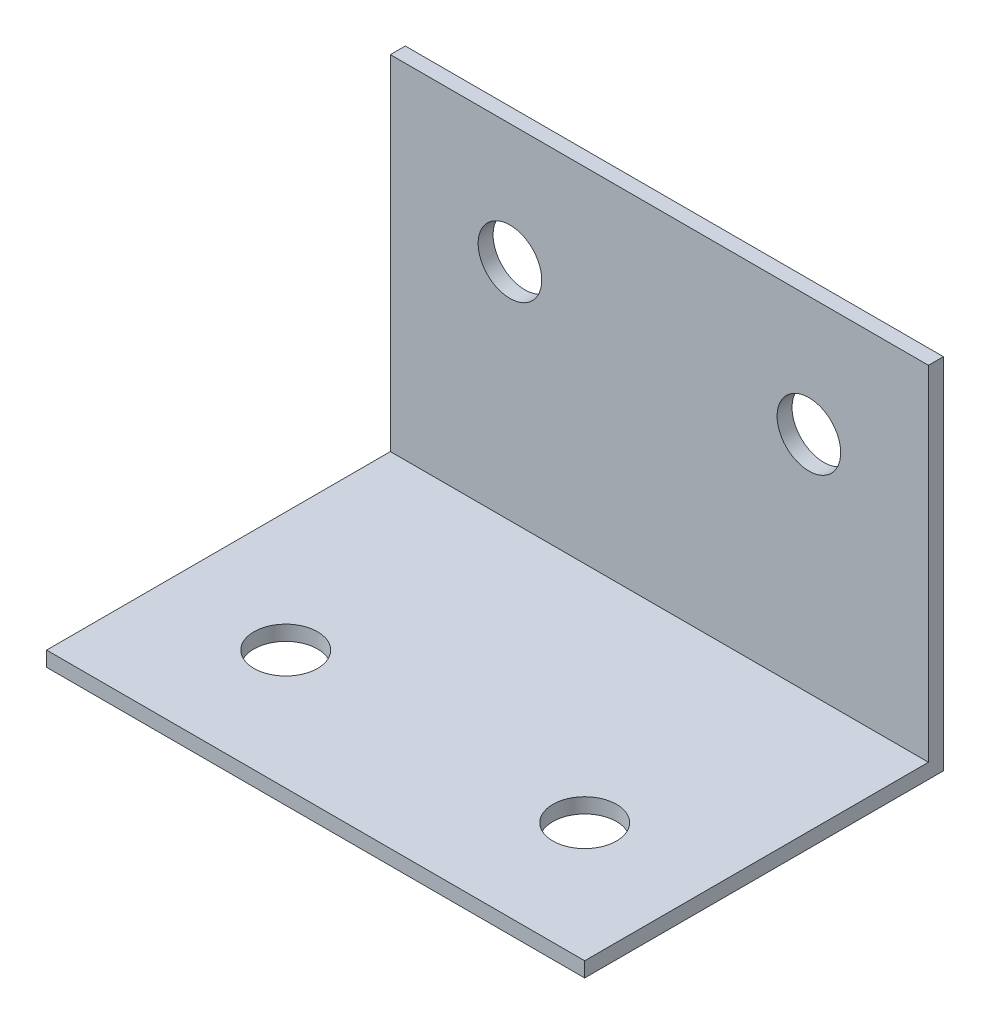
ISO-10303-21;
HEADER;
FILE_DESCRIPTION(('STEP AP214'),'2;1');
FILE_NAME('part.step','',(''),(''),'','','');
FILE_SCHEMA(('AUTOMOTIVE_DESIGN { 1 0 10303 214 1 1 1 1 }'));
ENDSEC;
DATA;
#1=APPLICATION_CONTEXT('core data for automotive mechanical design processes');
#2=APPLICATION_PROTOCOL_DEFINITION('international standard','automotive_design',2000,#1);
#3=PRODUCT_CONTEXT('',#1,'mechanical');
#4=PRODUCT('Part','Part','',(#3));
#5=PRODUCT_RELATED_PRODUCT_CATEGORY('part','',(#4));
#6=PRODUCT_DEFINITION_FORMATION('','',#4);
#7=PRODUCT_DEFINITION_CONTEXT('part definition',#1,'design');
#8=PRODUCT_DEFINITION('design','',#6,#7);
#9=PRODUCT_DEFINITION_SHAPE('','',#8);
#10=(LENGTH_UNIT() NAMED_UNIT(*) SI_UNIT(.MILLI.,.METRE.));
#11=(NAMED_UNIT(*) PLANE_ANGLE_UNIT() SI_UNIT($,.RADIAN.));
#12=(NAMED_UNIT(*) SI_UNIT($,.STERADIAN.) SOLID_ANGLE_UNIT());
#13=UNCERTAINTY_MEASURE_WITH_UNIT(LENGTH_MEASURE(1.E-05),#10,'distance_accuracy_value','');
#14=(GEOMETRIC_REPRESENTATION_CONTEXT(3) GLOBAL_UNCERTAINTY_ASSIGNED_CONTEXT((#13)) GLOBAL_UNIT_ASSIGNED_CONTEXT((#10,
#11,#12)) REPRESENTATION_CONTEXT('',''));
#15=CARTESIAN_POINT('',(0.,0.,0.));
#16=DIRECTION('',(0.,0.,1.));
#17=DIRECTION('',(1.,0.,0.));
#18=AXIS2_PLACEMENT_3D('',#15,#16,#17);
#19=CARTESIAN_POINT('',(0.,1.5875,0.));
#20=DIRECTION('',(0.,-1.,0.));
#21=DIRECTION('',(0.,0.,-1.));
#22=AXIS2_PLACEMENT_3D('',#19,#20,#21);
#23=PLANE('',#22);
#24=DIRECTION('',(1.,0.,0.));
#25=VECTOR('',#24,1.);
#26=CARTESIAN_POINT('',(-28.575,1.5875,38.1));
#27=LINE('',#26,#25);
#28=CARTESIAN_POINT('',(-28.575,1.5875,38.1));
#29=VERTEX_POINT('',#28);
#30=CARTESIAN_POINT('',(28.575,1.5875,38.1));
#31=VERTEX_POINT('',#30);
#32=EDGE_CURVE('E75',#29,#31,#27,.T.);
#33=ORIENTED_EDGE('',*,*,#32,.T.);
#34=DIRECTION('',(0.,0.,-1.));
#35=VECTOR('',#34,1.);
#36=CARTESIAN_POINT('',(28.575,1.5875,38.1));
#37=LINE('',#36,#35);
#38=CARTESIAN_POINT('',(28.575,1.58749999999999,1.58749999999987));
#39=VERTEX_POINT('',#38);
#40=EDGE_CURVE('E123',#31,#39,#37,.T.);
#41=ORIENTED_EDGE('',*,*,#40,.T.);
#42=DIRECTION('',(1.,0.,0.));
#43=VECTOR('',#42,1.);
#44=CARTESIAN_POINT('',(-28.575,1.58749999999999,1.58749999999987));
#45=LINE('',#44,#43);
#46=CARTESIAN_POINT('',(-28.575,1.58749999999999,1.58749999999987));
#47=VERTEX_POINT('',#46);
#48=EDGE_CURVE('E130',#47,#39,#45,.T.);
#49=ORIENTED_EDGE('',*,*,#48,.F.);
#50=DIRECTION('',(0.,0.,1.));
#51=VECTOR('',#50,1.);
#52=CARTESIAN_POINT('',(-28.575,1.5875,38.1));
#53=LINE('',#52,#51);
#54=EDGE_CURVE('E120',#47,#29,#53,.T.);
#55=ORIENTED_EDGE('',*,*,#54,.T.);
#56=EDGE_LOOP('',(#33,#41,#49,#55));
#57=FACE_BOUND('',#56,.T.);
#58=CARTESIAN_POINT('',(15.875,1.5875,25.4));
#59=DIRECTION('',(0.,1.,0.));
#60=DIRECTION('',(0.,0.,1.));
#61=AXIS2_PLACEMENT_3D('',#58,#59,#60);
#62=CIRCLE('',#61,3.3782);
#63=CARTESIAN_POINT('',(15.875,1.5875,28.7782));
#64=VERTEX_POINT('',#63);
#65=EDGE_CURVE('E159',#64,#64,#62,.T.);
#66=ORIENTED_EDGE('',*,*,#65,.F.);
#67=EDGE_LOOP('',(#66));
#68=FACE_BOUND('',#67,.T.);
#69=CARTESIAN_POINT('',(-15.875,1.5875,25.4));
#70=DIRECTION('',(0.,1.,0.));
#71=DIRECTION('',(0.,0.,1.));
#72=AXIS2_PLACEMENT_3D('',#69,#70,#71);
#73=CIRCLE('',#72,3.3782);
#74=CARTESIAN_POINT('',(-15.875,1.5875,28.7782));
#75=VERTEX_POINT('',#74);
#76=EDGE_CURVE('E153',#75,#75,#73,.T.);
#77=ORIENTED_EDGE('',*,*,#76,.F.);
#78=EDGE_LOOP('',(#77));
#79=FACE_BOUND('',#78,.T.);
#80=ADVANCED_FACE('F58',(#57,#68,#79),#23,.F.);
#81=CARTESIAN_POINT('',(28.575,1.5875,38.1));
#82=DIRECTION('',(-1.,0.,0.));
#83=DIRECTION('',(0.,0.,1.));
#84=AXIS2_PLACEMENT_3D('',#81,#82,#83);
#85=PLANE('',#84);
#86=DIRECTION('',(0.,0.,-1.));
#87=VECTOR('',#86,1.);
#88=CARTESIAN_POINT('',(28.575,0.,38.1));
#89=LINE('',#88,#87);
#90=CARTESIAN_POINT('',(28.575,0.,38.1));
#91=VERTEX_POINT('',#90);
#92=CARTESIAN_POINT('',(28.575,0.,0.));
#93=VERTEX_POINT('',#92);
#94=EDGE_CURVE('E167',#91,#93,#89,.T.);
#95=ORIENTED_EDGE('',*,*,#94,.T.);
#96=DIRECTION('',(0.,-1.,0.));
#97=VECTOR('',#96,1.);
#98=CARTESIAN_POINT('',(28.575,0.,0.));
#99=LINE('',#98,#97);
#100=CARTESIAN_POINT('',(28.575,38.1,-1.26803963274151E-13));
#101=VERTEX_POINT('',#100);
#102=EDGE_CURVE('E174',#101,#93,#99,.T.);
#103=ORIENTED_EDGE('',*,*,#102,.F.);
#104=DIRECTION('',(0.,0.,1.));
#105=VECTOR('',#104,1.);
#106=CARTESIAN_POINT('',(28.575,38.1,-1.26832191081019E-13));
#107=LINE('',#106,#105);
#108=CARTESIAN_POINT('',(28.575,38.1,1.58749999999987));
#109=VERTEX_POINT('',#108);
#110=EDGE_CURVE('E168',#101,#109,#107,.T.);
#111=ORIENTED_EDGE('',*,*,#110,.T.);
#112=DIRECTION('',(0.,1.,0.));
#113=VECTOR('',#112,1.);
#114=CARTESIAN_POINT('',(28.575,1.5875,1.5875));
#115=LINE('',#114,#113);
#116=EDGE_CURVE('E132',#109,#39,#115,.F.);
#117=ORIENTED_EDGE('',*,*,#116,.T.);
#118=ORIENTED_EDGE('',*,*,#40,.F.);
#119=DIRECTION('',(0.,-1.,0.));
#120=VECTOR('',#119,1.);
#121=CARTESIAN_POINT('',(28.575,1.5875,38.1));
#122=LINE('',#121,#120);
#123=EDGE_CURVE('E67',#31,#91,#122,.T.);
#124=ORIENTED_EDGE('',*,*,#123,.T.);
#125=EDGE_LOOP('',(#95,#103,#111,#117,#118,#124));
#126=FACE_BOUND('',#125,.T.);
#127=ADVANCED_FACE('F60',(#126),#85,.F.);
#128=CARTESIAN_POINT('',(-28.575,1.5875,38.1));
#129=DIRECTION('',(1.,0.,0.));
#130=DIRECTION('',(0.,0.,-1.));
#131=AXIS2_PLACEMENT_3D('',#128,#129,#130);
#132=PLANE('',#131);
#133=ORIENTED_EDGE('',*,*,#54,.F.);
#134=DIRECTION('',(0.,-1.,0.));
#135=VECTOR('',#134,1.);
#136=CARTESIAN_POINT('',(-28.575,38.1,1.58749999999987));
#137=LINE('',#136,#135);
#138=CARTESIAN_POINT('',(-28.575,38.1,1.58749999999987));
#139=VERTEX_POINT('',#138);
#140=EDGE_CURVE('E110',#47,#139,#137,.F.);
#141=ORIENTED_EDGE('',*,*,#140,.T.);
#142=DIRECTION('',(0.,0.,1.));
#143=VECTOR('',#142,1.);
#144=CARTESIAN_POINT('',(-28.575,38.1,-1.27151541320512E-13));
#145=LINE('',#144,#143);
#146=CARTESIAN_POINT('',(-28.575,38.1,-1.27103850413858E-13));
#147=VERTEX_POINT('',#146);
#148=EDGE_CURVE('E165',#147,#139,#145,.T.);
#149=ORIENTED_EDGE('',*,*,#148,.F.);
#150=DIRECTION('',(0.,1.,0.));
#151=VECTOR('',#150,1.);
#152=CARTESIAN_POINT('',(-28.575,0.,0.));
#153=LINE('',#152,#151);
#154=CARTESIAN_POINT('',(-28.575,0.,0.));
#155=VERTEX_POINT('',#154);
#156=EDGE_CURVE('E172',#155,#147,#153,.T.);
#157=ORIENTED_EDGE('',*,*,#156,.F.);
#158=DIRECTION('',(0.,0.,1.));
#159=VECTOR('',#158,1.);
#160=CARTESIAN_POINT('',(-28.575,0.,38.1));
#161=LINE('',#160,#159);
#162=CARTESIAN_POINT('',(-28.575,0.,38.1));
#163=VERTEX_POINT('',#162);
#164=EDGE_CURVE('E86',#155,#163,#161,.T.);
#165=ORIENTED_EDGE('',*,*,#164,.T.);
#166=DIRECTION('',(0.,-1.,0.));
#167=VECTOR('',#166,1.);
#168=CARTESIAN_POINT('',(-28.575,1.5875,38.1));
#169=LINE('',#168,#167);
#170=EDGE_CURVE('E13',#29,#163,#169,.T.);
#171=ORIENTED_EDGE('',*,*,#170,.F.);
#172=EDGE_LOOP('',(#133,#141,#149,#157,#165,#171));
#173=FACE_BOUND('',#172,.T.);
#174=ADVANCED_FACE('F121',(#173),#132,.F.);
#175=CARTESIAN_POINT('',(0.,0.,0.));
#176=DIRECTION('',(0.,-1.,0.));
#177=DIRECTION('',(0.,0.,-1.));
#178=AXIS2_PLACEMENT_3D('',#175,#176,#177);
#179=PLANE('',#178);
#180=DIRECTION('',(1.,0.,0.));
#181=VECTOR('',#180,1.);
#182=CARTESIAN_POINT('',(-28.575,0.,0.));
#183=LINE('',#182,#181);
#184=EDGE_CURVE('E137',#155,#93,#183,.T.);
#185=ORIENTED_EDGE('',*,*,#184,.T.);
#186=ORIENTED_EDGE('',*,*,#94,.F.);
#187=DIRECTION('',(1.,0.,0.));
#188=VECTOR('',#187,1.);
#189=CARTESIAN_POINT('',(-28.575,0.,38.1));
#190=LINE('',#189,#188);
#191=EDGE_CURVE('E178',#163,#91,#190,.T.);
#192=ORIENTED_EDGE('',*,*,#191,.F.);
#193=ORIENTED_EDGE('',*,*,#164,.F.);
#194=EDGE_LOOP('',(#185,#186,#192,#193));
#195=FACE_BOUND('',#194,.T.);
#196=CARTESIAN_POINT('',(-15.875,0.,25.4));
#197=DIRECTION('',(0.,-1.,0.));
#198=DIRECTION('',(0.,0.,-1.));
#199=AXIS2_PLACEMENT_3D('',#196,#197,#198);
#200=CIRCLE('',#199,3.3782);
#201=CARTESIAN_POINT('',(-15.875,0.,22.0218));
#202=VERTEX_POINT('',#201);
#203=EDGE_CURVE('E156',#202,#202,#200,.T.);
#204=ORIENTED_EDGE('',*,*,#203,.F.);
#205=EDGE_LOOP('',(#204));
#206=FACE_BOUND('',#205,.T.);
#207=CARTESIAN_POINT('',(15.875,0.,25.4));
#208=DIRECTION('',(0.,-1.,0.));
#209=DIRECTION('',(0.,0.,-1.));
#210=AXIS2_PLACEMENT_3D('',#207,#208,#209);
#211=CIRCLE('',#210,3.3782);
#212=CARTESIAN_POINT('',(15.875,0.,22.0218));
#213=VERTEX_POINT('',#212);
#214=EDGE_CURVE('E162',#213,#213,#211,.T.);
#215=ORIENTED_EDGE('',*,*,#214,.F.);
#216=EDGE_LOOP('',(#215));
#217=FACE_BOUND('',#216,.T.);
#218=ADVANCED_FACE('F189',(#195,#206,#217),#179,.T.);
#219=CARTESIAN_POINT('',(-28.575,1.5875,38.1));
#220=DIRECTION('',(0.,0.,-1.));
#221=DIRECTION('',(-1.,0.,0.));
#222=AXIS2_PLACEMENT_3D('',#219,#220,#221);
#223=PLANE('',#222);
#224=ORIENTED_EDGE('',*,*,#191,.T.);
#225=ORIENTED_EDGE('',*,*,#123,.F.);
#226=ORIENTED_EDGE('',*,*,#32,.F.);
#227=ORIENTED_EDGE('',*,*,#170,.T.);
#228=EDGE_LOOP('',(#224,#225,#226,#227));
#229=FACE_BOUND('',#228,.T.);
#230=ADVANCED_FACE('F215',(#229),#223,.F.);
#231=CARTESIAN_POINT('',(0.,0.,0.));
#232=DIRECTION('',(0.,0.,1.));
#233=DIRECTION('',(0.,-1.,0.));
#234=AXIS2_PLACEMENT_3D('',#231,#232,#233);
#235=PLANE('',#234);
#236=DIRECTION('',(1.,0.,0.));
#237=VECTOR('',#236,1.);
#238=CARTESIAN_POINT('',(0.,38.1,-1.26953906844004E-13));
#239=LINE('',#238,#237);
#240=EDGE_CURVE('E95',#147,#101,#239,.T.);
#241=ORIENTED_EDGE('',*,*,#240,.T.);
#242=ORIENTED_EDGE('',*,*,#102,.T.);
#243=ORIENTED_EDGE('',*,*,#184,.F.);
#244=ORIENTED_EDGE('',*,*,#156,.T.);
#245=EDGE_LOOP('',(#241,#242,#243,#244));
#246=FACE_BOUND('',#245,.T.);
#247=CARTESIAN_POINT('',(15.875,25.4,0.));
#248=DIRECTION('',(0.,0.,1.));
#249=DIRECTION('',(0.,-1.,0.));
#250=AXIS2_PLACEMENT_3D('',#247,#248,#249);
#251=CIRCLE('',#250,3.37819999999999);
#252=CARTESIAN_POINT('',(15.875,22.0218,0.));
#253=VERTEX_POINT('',#252);
#254=EDGE_CURVE('E150',#253,#253,#251,.T.);
#255=ORIENTED_EDGE('',*,*,#254,.T.);
#256=EDGE_LOOP('',(#255));
#257=FACE_BOUND('',#256,.T.);
#258=CARTESIAN_POINT('',(-15.875,25.4,0.));
#259=DIRECTION('',(0.,0.,1.));
#260=DIRECTION('',(0.,-1.,0.));
#261=AXIS2_PLACEMENT_3D('',#258,#259,#260);
#262=CIRCLE('',#261,3.37819999999999);
#263=CARTESIAN_POINT('',(-15.875,22.0218,0.));
#264=VERTEX_POINT('',#263);
#265=EDGE_CURVE('E144',#264,#264,#262,.T.);
#266=ORIENTED_EDGE('',*,*,#265,.T.);
#267=EDGE_LOOP('',(#266));
#268=FACE_BOUND('',#267,.T.);
#269=ADVANCED_FACE('F192',(#246,#257,#268),#235,.F.);
#270=CARTESIAN_POINT('',(0.,0.,1.58750000000001));
#271=DIRECTION('',(0.,0.,1.));
#272=DIRECTION('',(0.,-1.,0.));
#273=AXIS2_PLACEMENT_3D('',#270,#271,#272);
#274=PLANE('',#273);
#275=ORIENTED_EDGE('',*,*,#48,.T.);
#276=ORIENTED_EDGE('',*,*,#116,.F.);
#277=DIRECTION('',(-1.,0.,0.));
#278=VECTOR('',#277,1.);
#279=CARTESIAN_POINT('',(28.575,38.1,1.58749999999987));
#280=LINE('',#279,#278);
#281=EDGE_CURVE('E131',#139,#109,#280,.F.);
#282=ORIENTED_EDGE('',*,*,#281,.F.);
#283=ORIENTED_EDGE('',*,*,#140,.F.);
#284=EDGE_LOOP('',(#275,#276,#282,#283));
#285=FACE_BOUND('',#284,.T.);
#286=CARTESIAN_POINT('',(-15.875,25.4,1.58750000000001));
#287=DIRECTION('',(0.,0.,1.));
#288=DIRECTION('',(1.,0.,0.));
#289=AXIS2_PLACEMENT_3D('',#286,#287,#288);
#290=CIRCLE('',#289,3.37819999999999);
#291=CARTESIAN_POINT('',(-12.4968,25.4,1.58750000000001));
#292=VERTEX_POINT('',#291);
#293=EDGE_CURVE('E139',#292,#292,#290,.T.);
#294=ORIENTED_EDGE('',*,*,#293,.F.);
#295=EDGE_LOOP('',(#294));
#296=FACE_BOUND('',#295,.T.);
#297=CARTESIAN_POINT('',(15.875,25.4,1.58750000000001));
#298=DIRECTION('',(0.,0.,1.));
#299=DIRECTION('',(1.,0.,0.));
#300=AXIS2_PLACEMENT_3D('',#297,#298,#299);
#301=CIRCLE('',#300,3.37819999999999);
#302=CARTESIAN_POINT('',(19.2532,25.4,1.58750000000001));
#303=VERTEX_POINT('',#302);
#304=EDGE_CURVE('E147',#303,#303,#301,.T.);
#305=ORIENTED_EDGE('',*,*,#304,.F.);
#306=EDGE_LOOP('',(#305));
#307=FACE_BOUND('',#306,.T.);
#308=ADVANCED_FACE('F127',(#285,#296,#307),#274,.T.);
#309=CARTESIAN_POINT('',(28.575,38.1,-1.26851654180804E-13));
#310=DIRECTION('',(0.,-1.,0.));
#311=DIRECTION('',(0.,0.,-1.));
#312=AXIS2_PLACEMENT_3D('',#309,#310,#311);
#313=PLANE('',#312);
#314=ORIENTED_EDGE('',*,*,#281,.T.);
#315=ORIENTED_EDGE('',*,*,#110,.F.);
#316=ORIENTED_EDGE('',*,*,#240,.F.);
#317=ORIENTED_EDGE('',*,*,#148,.T.);
#318=EDGE_LOOP('',(#314,#315,#316,#317));
#319=FACE_BOUND('',#318,.T.);
#320=ADVANCED_FACE('F195',(#319),#313,.F.);
#321=CARTESIAN_POINT('',(15.875,1.5875,25.4));
#322=DIRECTION('',(0.,1.,0.));
#323=DIRECTION('',(0.,0.,1.));
#324=AXIS2_PLACEMENT_3D('',#321,#322,#323);
#325=CYLINDRICAL_SURFACE('',#324,3.3782);
#326=ORIENTED_EDGE('',*,*,#65,.T.);
#327=EDGE_LOOP('',(#326));
#328=FACE_BOUND('',#327,.T.);
#329=ORIENTED_EDGE('',*,*,#214,.T.);
#330=EDGE_LOOP('',(#329));
#331=FACE_BOUND('',#330,.T.);
#332=ADVANCED_FACE('F197',(#328,#331),#325,.F.);
#333=CARTESIAN_POINT('',(-15.875,1.5875,25.4));
#334=DIRECTION('',(0.,1.,0.));
#335=DIRECTION('',(0.,0.,1.));
#336=AXIS2_PLACEMENT_3D('',#333,#334,#335);
#337=CYLINDRICAL_SURFACE('',#336,3.3782);
#338=ORIENTED_EDGE('',*,*,#76,.T.);
#339=EDGE_LOOP('',(#338));
#340=FACE_BOUND('',#339,.T.);
#341=ORIENTED_EDGE('',*,*,#203,.T.);
#342=EDGE_LOOP('',(#341));
#343=FACE_BOUND('',#342,.T.);
#344=ADVANCED_FACE('F203',(#340,#343),#337,.F.);
#345=CARTESIAN_POINT('',(15.875,25.4,1.58750000000001));
#346=DIRECTION('',(0.,0.,1.));
#347=DIRECTION('',(1.,0.,0.));
#348=AXIS2_PLACEMENT_3D('',#345,#346,#347);
#349=CYLINDRICAL_SURFACE('',#348,3.37819999999999);
#350=ORIENTED_EDGE('',*,*,#254,.F.);
#351=EDGE_LOOP('',(#350));
#352=FACE_BOUND('',#351,.T.);
#353=ORIENTED_EDGE('',*,*,#304,.T.);
#354=EDGE_LOOP('',(#353));
#355=FACE_BOUND('',#354,.T.);
#356=ADVANCED_FACE('F276',(#352,#355),#349,.F.);
#357=CARTESIAN_POINT('',(-15.875,25.4,1.58750000000001));
#358=DIRECTION('',(0.,0.,1.));
#359=DIRECTION('',(1.,0.,0.));
#360=AXIS2_PLACEMENT_3D('',#357,#358,#359);
#361=CYLINDRICAL_SURFACE('',#360,3.37819999999999);
#362=ORIENTED_EDGE('',*,*,#265,.F.);
#363=EDGE_LOOP('',(#362));
#364=FACE_BOUND('',#363,.T.);
#365=ORIENTED_EDGE('',*,*,#293,.T.);
#366=EDGE_LOOP('',(#365));
#367=FACE_BOUND('',#366,.T.);
#368=ADVANCED_FACE('F285',(#364,#367),#361,.F.);
#369=CLOSED_SHELL('',(#80,#127,#174,#218,#230,#269,#308,#320,#332,#344,#356,#368));
#370=MANIFOLD_SOLID_BREP('B2',#369);
#371=ADVANCED_BREP_SHAPE_REPRESENTATION('',(#18,#370),#14);
#372=SHAPE_DEFINITION_REPRESENTATION(#9,#371);
ENDSEC;
END-ISO-10303-21;
